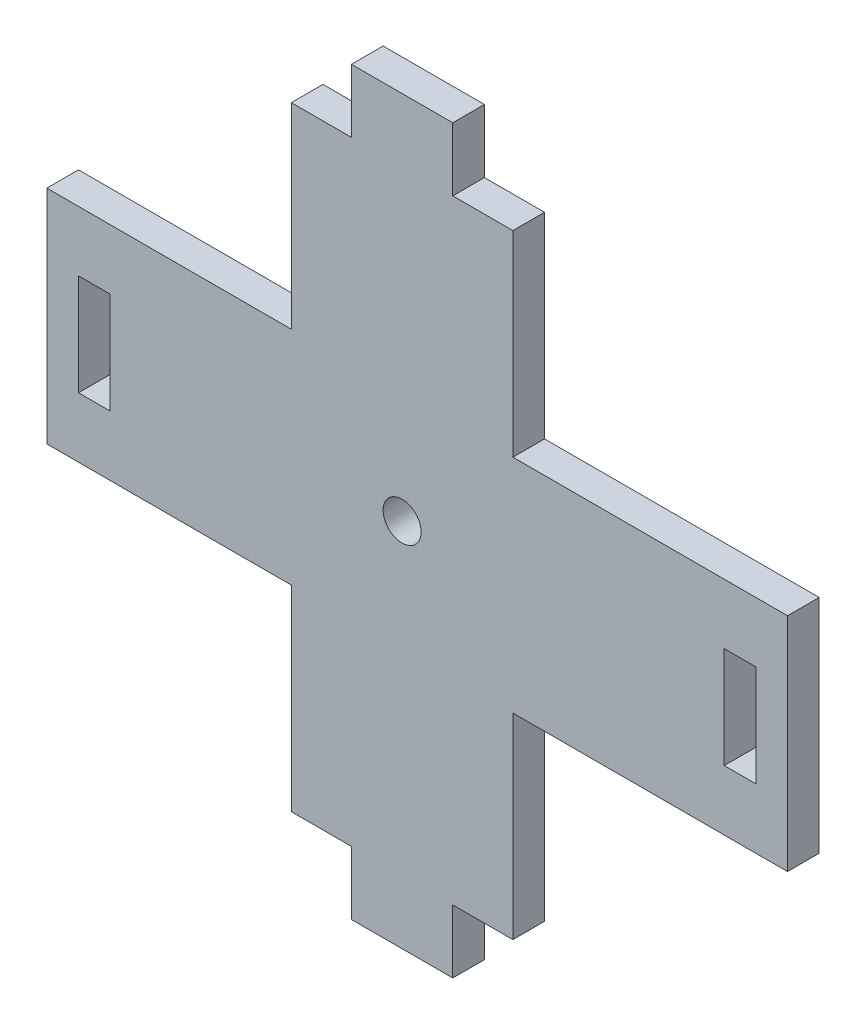
ISO-10303-21;
HEADER;
FILE_DESCRIPTION(('STEP AP214'),'2;1');
FILE_NAME('part.step','',(''),(''),'','','');
FILE_SCHEMA(('AUTOMOTIVE_DESIGN { 1 0 10303 214 1 1 1 1 }'));
ENDSEC;
DATA;
#1=APPLICATION_CONTEXT('core data for automotive mechanical design processes');
#2=APPLICATION_PROTOCOL_DEFINITION('international standard','automotive_design',2000,#1);
#3=PRODUCT_CONTEXT('',#1,'mechanical');
#4=PRODUCT('Part','Part','',(#3));
#5=PRODUCT_RELATED_PRODUCT_CATEGORY('part','',(#4));
#6=PRODUCT_DEFINITION_FORMATION('','',#4);
#7=PRODUCT_DEFINITION_CONTEXT('part definition',#1,'design');
#8=PRODUCT_DEFINITION('design','',#6,#7);
#9=PRODUCT_DEFINITION_SHAPE('','',#8);
#10=(LENGTH_UNIT() NAMED_UNIT(*) SI_UNIT(.MILLI.,.METRE.));
#11=(NAMED_UNIT(*) PLANE_ANGLE_UNIT() SI_UNIT($,.RADIAN.));
#12=(NAMED_UNIT(*) SI_UNIT($,.STERADIAN.) SOLID_ANGLE_UNIT());
#13=UNCERTAINTY_MEASURE_WITH_UNIT(LENGTH_MEASURE(1.E-05),#10,'distance_accuracy_value','');
#14=(GEOMETRIC_REPRESENTATION_CONTEXT(3) GLOBAL_UNCERTAINTY_ASSIGNED_CONTEXT((#13)) GLOBAL_UNIT_ASSIGNED_CONTEXT((#10,
#11,#12)) REPRESENTATION_CONTEXT('',''));
#15=CARTESIAN_POINT('',(0.,0.,0.));
#16=DIRECTION('',(0.,0.,1.));
#17=DIRECTION('',(1.,0.,0.));
#18=AXIS2_PLACEMENT_3D('',#15,#16,#17);
#19=CARTESIAN_POINT('',(0.,0.,5.));
#20=DIRECTION('',(1.,0.,0.));
#21=DIRECTION('',(0.,0.,-1.));
#22=AXIS2_PLACEMENT_3D('',#19,#20,#21);
#23=PLANE('',#22);
#24=DIRECTION('',(0.,-1.,0.));
#25=VECTOR('',#24,1.);
#26=CARTESIAN_POINT('',(0.,0.,0.));
#27=LINE('',#26,#25);
#28=CARTESIAN_POINT('',(0.,35.,0.));
#29=VERTEX_POINT('',#28);
#30=CARTESIAN_POINT('',(0.,0.,0.));
#31=VERTEX_POINT('',#30);
#32=EDGE_CURVE('E256',#29,#31,#27,.T.);
#33=ORIENTED_EDGE('',*,*,#32,.T.);
#34=DIRECTION('',(0.,0.,-1.));
#35=VECTOR('',#34,1.);
#36=CARTESIAN_POINT('',(0.,0.,5.));
#37=LINE('',#36,#35);
#38=CARTESIAN_POINT('',(0.,0.,5.));
#39=VERTEX_POINT('',#38);
#40=EDGE_CURVE('E11',#39,#31,#37,.T.);
#41=ORIENTED_EDGE('',*,*,#40,.F.);
#42=DIRECTION('',(0.,-1.,0.));
#43=VECTOR('',#42,1.);
#44=CARTESIAN_POINT('',(0.,0.,5.));
#45=LINE('',#44,#43);
#46=CARTESIAN_POINT('',(0.,35.,5.));
#47=VERTEX_POINT('',#46);
#48=EDGE_CURVE('E290',#47,#39,#45,.T.);
#49=ORIENTED_EDGE('',*,*,#48,.F.);
#50=DIRECTION('',(0.,0.,-1.));
#51=VECTOR('',#50,1.);
#52=CARTESIAN_POINT('',(0.,35.,5.));
#53=LINE('',#52,#51);
#54=EDGE_CURVE('E332',#47,#29,#53,.T.);
#55=ORIENTED_EDGE('',*,*,#54,.T.);
#56=EDGE_LOOP('',(#33,#41,#49,#55));
#57=FACE_BOUND('',#56,.T.);
#58=ADVANCED_FACE('F32',(#57),#23,.F.);
#59=CARTESIAN_POINT('',(0.,0.,5.));
#60=DIRECTION('',(0.,1.,0.));
#61=DIRECTION('',(0.,0.,1.));
#62=AXIS2_PLACEMENT_3D('',#59,#60,#61);
#63=PLANE('',#62);
#64=DIRECTION('',(1.,0.,0.));
#65=VECTOR('',#64,1.);
#66=CARTESIAN_POINT('',(0.,0.,0.));
#67=LINE('',#66,#65);
#68=CARTESIAN_POINT('',(38.6194976198017,0.,0.));
#69=VERTEX_POINT('',#68);
#70=EDGE_CURVE('E335',#31,#69,#67,.T.);
#71=ORIENTED_EDGE('',*,*,#70,.T.);
#72=DIRECTION('',(0.,0.,-1.));
#73=VECTOR('',#72,1.);
#74=CARTESIAN_POINT('',(38.6194976198017,0.,5.));
#75=LINE('',#74,#73);
#76=CARTESIAN_POINT('',(38.6194976198017,0.,5.));
#77=VERTEX_POINT('',#76);
#78=EDGE_CURVE('E39',#77,#69,#75,.T.);
#79=ORIENTED_EDGE('',*,*,#78,.F.);
#80=DIRECTION('',(1.,0.,0.));
#81=VECTOR('',#80,1.);
#82=CARTESIAN_POINT('',(0.,0.,5.));
#83=LINE('',#82,#81);
#84=EDGE_CURVE('E293',#39,#77,#83,.T.);
#85=ORIENTED_EDGE('',*,*,#84,.F.);
#86=ORIENTED_EDGE('',*,*,#40,.T.);
#87=EDGE_LOOP('',(#71,#79,#85,#86));
#88=FACE_BOUND('',#87,.T.);
#89=ADVANCED_FACE('F451',(#88),#63,.F.);
#90=CARTESIAN_POINT('',(38.6194976198017,0.,5.));
#91=DIRECTION('',(1.,0.,0.));
#92=DIRECTION('',(0.,1.,0.));
#93=AXIS2_PLACEMENT_3D('',#90,#91,#92);
#94=PLANE('',#93);
#95=DIRECTION('',(0.,-1.,0.));
#96=VECTOR('',#95,1.);
#97=CARTESIAN_POINT('',(38.6194976198017,0.,0.));
#98=LINE('',#97,#96);
#99=CARTESIAN_POINT('',(38.6194976198017,-31.,0.));
#100=VERTEX_POINT('',#99);
#101=EDGE_CURVE('E337',#69,#100,#98,.T.);
#102=ORIENTED_EDGE('',*,*,#101,.T.);
#103=DIRECTION('',(0.,0.,-1.));
#104=VECTOR('',#103,1.);
#105=CARTESIAN_POINT('',(38.6194976198017,-31.,5.));
#106=LINE('',#105,#104);
#107=CARTESIAN_POINT('',(38.6194976198017,-31.,5.));
#108=VERTEX_POINT('',#107);
#109=EDGE_CURVE('E422',#108,#100,#106,.T.);
#110=ORIENTED_EDGE('',*,*,#109,.F.);
#111=DIRECTION('',(0.,-1.,0.));
#112=VECTOR('',#111,1.);
#113=CARTESIAN_POINT('',(38.6194976198017,0.,5.));
#114=LINE('',#113,#112);
#115=EDGE_CURVE('E296',#77,#108,#114,.T.);
#116=ORIENTED_EDGE('',*,*,#115,.F.);
#117=ORIENTED_EDGE('',*,*,#78,.T.);
#118=EDGE_LOOP('',(#102,#110,#116,#117));
#119=FACE_BOUND('',#118,.T.);
#120=ADVANCED_FACE('F429',(#119),#94,.F.);
#121=CARTESIAN_POINT('',(38.6194976198017,-31.,5.));
#122=DIRECTION('',(0.,1.,0.));
#123=DIRECTION('',(-1.,0.,0.));
#124=AXIS2_PLACEMENT_3D('',#121,#122,#123);
#125=PLANE('',#124);
#126=DIRECTION('',(1.,0.,0.));
#127=VECTOR('',#126,1.);
#128=CARTESIAN_POINT('',(38.6194976198017,-31.,0.));
#129=LINE('',#128,#127);
#130=CARTESIAN_POINT('',(48.1194976198017,-31.,0.));
#131=VERTEX_POINT('',#130);
#132=EDGE_CURVE('E339',#100,#131,#129,.T.);
#133=ORIENTED_EDGE('',*,*,#132,.T.);
#134=DIRECTION('',(0.,0.,-1.));
#135=VECTOR('',#134,1.);
#136=CARTESIAN_POINT('',(48.1194976198017,-31.,5.));
#137=LINE('',#136,#135);
#138=CARTESIAN_POINT('',(48.1194976198017,-31.,5.));
#139=VERTEX_POINT('',#138);
#140=EDGE_CURVE('E419',#139,#131,#137,.T.);
#141=ORIENTED_EDGE('',*,*,#140,.F.);
#142=DIRECTION('',(1.,0.,0.));
#143=VECTOR('',#142,1.);
#144=CARTESIAN_POINT('',(38.6194976198017,-31.,5.));
#145=LINE('',#144,#143);
#146=EDGE_CURVE('E298',#108,#139,#145,.T.);
#147=ORIENTED_EDGE('',*,*,#146,.F.);
#148=ORIENTED_EDGE('',*,*,#109,.T.);
#149=EDGE_LOOP('',(#133,#141,#147,#148));
#150=FACE_BOUND('',#149,.T.);
#151=ADVANCED_FACE('F439',(#150),#125,.F.);
#152=CARTESIAN_POINT('',(48.1194976198017,-31.,5.));
#153=DIRECTION('',(1.,0.,0.));
#154=DIRECTION('',(0.,0.,-1.));
#155=AXIS2_PLACEMENT_3D('',#152,#153,#154);
#156=PLANE('',#155);
#157=DIRECTION('',(0.,-1.,0.));
#158=VECTOR('',#157,1.);
#159=CARTESIAN_POINT('',(48.1194976198017,-31.,0.));
#160=LINE('',#159,#158);
#161=CARTESIAN_POINT('',(48.1194976198017,-41.,0.));
#162=VERTEX_POINT('',#161);
#163=EDGE_CURVE('E341',#131,#162,#160,.T.);
#164=ORIENTED_EDGE('',*,*,#163,.T.);
#165=DIRECTION('',(0.,0.,-1.));
#166=VECTOR('',#165,1.);
#167=CARTESIAN_POINT('',(48.1194976198017,-41.,5.));
#168=LINE('',#167,#166);
#169=CARTESIAN_POINT('',(48.1194976198017,-41.,5.));
#170=VERTEX_POINT('',#169);
#171=EDGE_CURVE('E416',#170,#162,#168,.T.);
#172=ORIENTED_EDGE('',*,*,#171,.F.);
#173=DIRECTION('',(0.,-1.,0.));
#174=VECTOR('',#173,1.);
#175=CARTESIAN_POINT('',(48.1194976198017,-31.,5.));
#176=LINE('',#175,#174);
#177=EDGE_CURVE('E300',#139,#170,#176,.T.);
#178=ORIENTED_EDGE('',*,*,#177,.F.);
#179=ORIENTED_EDGE('',*,*,#140,.T.);
#180=EDGE_LOOP('',(#164,#172,#178,#179));
#181=FACE_BOUND('',#180,.T.);
#182=ADVANCED_FACE('F443',(#181),#156,.F.);
#183=CARTESIAN_POINT('',(48.1194976198017,-41.,5.));
#184=DIRECTION('',(0.,1.,0.));
#185=DIRECTION('',(0.,0.,1.));
#186=AXIS2_PLACEMENT_3D('',#183,#184,#185);
#187=PLANE('',#186);
#188=DIRECTION('',(1.,0.,0.));
#189=VECTOR('',#188,1.);
#190=CARTESIAN_POINT('',(48.1194976198017,-41.,0.));
#191=LINE('',#190,#189);
#192=CARTESIAN_POINT('',(64.1194976198017,-41.,0.));
#193=VERTEX_POINT('',#192);
#194=EDGE_CURVE('E343',#162,#193,#191,.T.);
#195=ORIENTED_EDGE('',*,*,#194,.T.);
#196=DIRECTION('',(0.,0.,-1.));
#197=VECTOR('',#196,1.);
#198=CARTESIAN_POINT('',(64.1194976198017,-41.,5.));
#199=LINE('',#198,#197);
#200=CARTESIAN_POINT('',(64.1194976198017,-41.,5.));
#201=VERTEX_POINT('',#200);
#202=EDGE_CURVE('E413',#201,#193,#199,.T.);
#203=ORIENTED_EDGE('',*,*,#202,.F.);
#204=DIRECTION('',(1.,0.,0.));
#205=VECTOR('',#204,1.);
#206=CARTESIAN_POINT('',(48.1194976198017,-41.,5.));
#207=LINE('',#206,#205);
#208=EDGE_CURVE('E302',#170,#201,#207,.T.);
#209=ORIENTED_EDGE('',*,*,#208,.F.);
#210=ORIENTED_EDGE('',*,*,#171,.T.);
#211=EDGE_LOOP('',(#195,#203,#209,#210));
#212=FACE_BOUND('',#211,.T.);
#213=ADVANCED_FACE('F524',(#212),#187,.F.);
#214=CARTESIAN_POINT('',(64.1194976198017,-31.,5.));
#215=DIRECTION('',(-1.,0.,0.));
#216=DIRECTION('',(0.,0.,1.));
#217=AXIS2_PLACEMENT_3D('',#214,#215,#216);
#218=PLANE('',#217);
#219=DIRECTION('',(0.,1.,0.));
#220=VECTOR('',#219,1.);
#221=CARTESIAN_POINT('',(64.1194976198017,-31.,0.));
#222=LINE('',#221,#220);
#223=CARTESIAN_POINT('',(64.1194976198017,-31.,0.));
#224=VERTEX_POINT('',#223);
#225=EDGE_CURVE('E345',#193,#224,#222,.T.);
#226=ORIENTED_EDGE('',*,*,#225,.T.);
#227=DIRECTION('',(0.,0.,-1.));
#228=VECTOR('',#227,1.);
#229=CARTESIAN_POINT('',(64.1194976198017,-31.,5.));
#230=LINE('',#229,#228);
#231=CARTESIAN_POINT('',(64.1194976198017,-31.,5.));
#232=VERTEX_POINT('',#231);
#233=EDGE_CURVE('E410',#232,#224,#230,.T.);
#234=ORIENTED_EDGE('',*,*,#233,.F.);
#235=DIRECTION('',(0.,1.,0.));
#236=VECTOR('',#235,1.);
#237=CARTESIAN_POINT('',(64.1194976198017,-31.,5.));
#238=LINE('',#237,#236);
#239=EDGE_CURVE('E304',#201,#232,#238,.T.);
#240=ORIENTED_EDGE('',*,*,#239,.F.);
#241=ORIENTED_EDGE('',*,*,#202,.T.);
#242=EDGE_LOOP('',(#226,#234,#240,#241));
#243=FACE_BOUND('',#242,.T.);
#244=ADVANCED_FACE('F522',(#243),#218,.F.);
#245=CARTESIAN_POINT('',(64.1194976198017,-31.,5.));
#246=DIRECTION('',(0.,1.,0.));
#247=DIRECTION('',(0.,0.,1.));
#248=AXIS2_PLACEMENT_3D('',#245,#246,#247);
#249=PLANE('',#248);
#250=DIRECTION('',(1.,0.,0.));
#251=VECTOR('',#250,1.);
#252=CARTESIAN_POINT('',(64.1194976198017,-31.,0.));
#253=LINE('',#252,#251);
#254=CARTESIAN_POINT('',(73.6194976198017,-31.,0.));
#255=VERTEX_POINT('',#254);
#256=EDGE_CURVE('E347',#224,#255,#253,.T.);
#257=ORIENTED_EDGE('',*,*,#256,.T.);
#258=DIRECTION('',(0.,0.,-1.));
#259=VECTOR('',#258,1.);
#260=CARTESIAN_POINT('',(73.6194976198017,-31.,5.));
#261=LINE('',#260,#259);
#262=CARTESIAN_POINT('',(73.6194976198017,-31.,5.));
#263=VERTEX_POINT('',#262);
#264=EDGE_CURVE('E407',#263,#255,#261,.T.);
#265=ORIENTED_EDGE('',*,*,#264,.F.);
#266=DIRECTION('',(1.,0.,0.));
#267=VECTOR('',#266,1.);
#268=CARTESIAN_POINT('',(64.1194976198017,-31.,5.));
#269=LINE('',#268,#267);
#270=EDGE_CURVE('E306',#232,#263,#269,.T.);
#271=ORIENTED_EDGE('',*,*,#270,.F.);
#272=ORIENTED_EDGE('',*,*,#233,.T.);
#273=EDGE_LOOP('',(#257,#265,#271,#272));
#274=FACE_BOUND('',#273,.T.);
#275=ADVANCED_FACE('F517',(#274),#249,.F.);
#276=CARTESIAN_POINT('',(73.6194976198017,0.,5.));
#277=DIRECTION('',(-1.,0.,0.));
#278=DIRECTION('',(0.,-1.,0.));
#279=AXIS2_PLACEMENT_3D('',#276,#277,#278);
#280=PLANE('',#279);
#281=DIRECTION('',(0.,1.,0.));
#282=VECTOR('',#281,1.);
#283=CARTESIAN_POINT('',(73.6194976198017,0.,0.));
#284=LINE('',#283,#282);
#285=CARTESIAN_POINT('',(73.6194976198017,0.,0.));
#286=VERTEX_POINT('',#285);
#287=EDGE_CURVE('E349',#255,#286,#284,.T.);
#288=ORIENTED_EDGE('',*,*,#287,.T.);
#289=DIRECTION('',(0.,0.,-1.));
#290=VECTOR('',#289,1.);
#291=CARTESIAN_POINT('',(73.6194976198017,0.,5.));
#292=LINE('',#291,#290);
#293=CARTESIAN_POINT('',(73.6194976198017,0.,5.));
#294=VERTEX_POINT('',#293);
#295=EDGE_CURVE('E404',#294,#286,#292,.T.);
#296=ORIENTED_EDGE('',*,*,#295,.F.);
#297=DIRECTION('',(0.,1.,0.));
#298=VECTOR('',#297,1.);
#299=CARTESIAN_POINT('',(73.6194976198017,0.,5.));
#300=LINE('',#299,#298);
#301=EDGE_CURVE('E308',#263,#294,#300,.T.);
#302=ORIENTED_EDGE('',*,*,#301,.F.);
#303=ORIENTED_EDGE('',*,*,#264,.T.);
#304=EDGE_LOOP('',(#288,#296,#302,#303));
#305=FACE_BOUND('',#304,.T.);
#306=ADVANCED_FACE('F512',(#305),#280,.F.);
#307=CARTESIAN_POINT('',(73.6194976198017,0.,5.));
#308=DIRECTION('',(0.,1.,0.));
#309=DIRECTION('',(-1.,0.,0.));
#310=AXIS2_PLACEMENT_3D('',#307,#308,#309);
#311=PLANE('',#310);
#312=DIRECTION('',(1.,0.,0.));
#313=VECTOR('',#312,1.);
#314=CARTESIAN_POINT('',(73.6194976198017,0.,0.));
#315=LINE('',#314,#313);
#316=CARTESIAN_POINT('',(117.,0.,0.));
#317=VERTEX_POINT('',#316);
#318=EDGE_CURVE('E351',#286,#317,#315,.T.);
#319=ORIENTED_EDGE('',*,*,#318,.T.);
#320=DIRECTION('',(0.,0.,-1.));
#321=VECTOR('',#320,1.);
#322=CARTESIAN_POINT('',(117.,0.,5.));
#323=LINE('',#322,#321);
#324=CARTESIAN_POINT('',(117.,0.,5.));
#325=VERTEX_POINT('',#324);
#326=EDGE_CURVE('E401',#325,#317,#323,.T.);
#327=ORIENTED_EDGE('',*,*,#326,.F.);
#328=DIRECTION('',(1.,0.,0.));
#329=VECTOR('',#328,1.);
#330=CARTESIAN_POINT('',(73.6194976198017,0.,5.));
#331=LINE('',#330,#329);
#332=EDGE_CURVE('E310',#294,#325,#331,.T.);
#333=ORIENTED_EDGE('',*,*,#332,.F.);
#334=ORIENTED_EDGE('',*,*,#295,.T.);
#335=EDGE_LOOP('',(#319,#327,#333,#334));
#336=FACE_BOUND('',#335,.T.);
#337=ADVANCED_FACE('F508',(#336),#311,.F.);
#338=CARTESIAN_POINT('',(117.,0.,5.));
#339=DIRECTION('',(-1.,0.,0.));
#340=DIRECTION('',(0.,0.,1.));
#341=AXIS2_PLACEMENT_3D('',#338,#339,#340);
#342=PLANE('',#341);
#343=DIRECTION('',(0.,1.,0.));
#344=VECTOR('',#343,1.);
#345=CARTESIAN_POINT('',(117.,0.,0.));
#346=LINE('',#345,#344);
#347=CARTESIAN_POINT('',(117.,35.,0.));
#348=VERTEX_POINT('',#347);
#349=EDGE_CURVE('E353',#317,#348,#346,.T.);
#350=ORIENTED_EDGE('',*,*,#349,.T.);
#351=DIRECTION('',(0.,0.,-1.));
#352=VECTOR('',#351,1.);
#353=CARTESIAN_POINT('',(117.,35.,5.));
#354=LINE('',#353,#352);
#355=CARTESIAN_POINT('',(117.,35.,5.));
#356=VERTEX_POINT('',#355);
#357=EDGE_CURVE('E398',#356,#348,#354,.T.);
#358=ORIENTED_EDGE('',*,*,#357,.F.);
#359=DIRECTION('',(0.,1.,0.));
#360=VECTOR('',#359,1.);
#361=CARTESIAN_POINT('',(117.,0.,5.));
#362=LINE('',#361,#360);
#363=EDGE_CURVE('E312',#325,#356,#362,.T.);
#364=ORIENTED_EDGE('',*,*,#363,.F.);
#365=ORIENTED_EDGE('',*,*,#326,.T.);
#366=EDGE_LOOP('',(#350,#358,#364,#365));
#367=FACE_BOUND('',#366,.T.);
#368=ADVANCED_FACE('F503',(#367),#342,.F.);
#369=CARTESIAN_POINT('',(73.6194976198017,35.,5.));
#370=DIRECTION('',(0.,-1.,0.));
#371=DIRECTION('',(1.,0.,0.));
#372=AXIS2_PLACEMENT_3D('',#369,#370,#371);
#373=PLANE('',#372);
#374=DIRECTION('',(-1.,0.,0.));
#375=VECTOR('',#374,1.);
#376=CARTESIAN_POINT('',(73.6194976198017,35.,0.));
#377=LINE('',#376,#375);
#378=CARTESIAN_POINT('',(73.6194976198017,35.,0.));
#379=VERTEX_POINT('',#378);
#380=EDGE_CURVE('E355',#348,#379,#377,.T.);
#381=ORIENTED_EDGE('',*,*,#380,.T.);
#382=DIRECTION('',(0.,0.,-1.));
#383=VECTOR('',#382,1.);
#384=CARTESIAN_POINT('',(73.6194976198017,35.,5.));
#385=LINE('',#384,#383);
#386=CARTESIAN_POINT('',(73.6194976198017,35.,5.));
#387=VERTEX_POINT('',#386);
#388=EDGE_CURVE('E395',#387,#379,#385,.T.);
#389=ORIENTED_EDGE('',*,*,#388,.F.);
#390=DIRECTION('',(-1.,0.,0.));
#391=VECTOR('',#390,1.);
#392=CARTESIAN_POINT('',(73.6194976198017,35.,5.));
#393=LINE('',#392,#391);
#394=EDGE_CURVE('E314',#356,#387,#393,.T.);
#395=ORIENTED_EDGE('',*,*,#394,.F.);
#396=ORIENTED_EDGE('',*,*,#357,.T.);
#397=EDGE_LOOP('',(#381,#389,#395,#396));
#398=FACE_BOUND('',#397,.T.);
#399=ADVANCED_FACE('F497',(#398),#373,.F.);
#400=CARTESIAN_POINT('',(73.6194976198017,66.,5.));
#401=DIRECTION('',(-1.,0.,0.));
#402=DIRECTION('',(0.,0.,1.));
#403=AXIS2_PLACEMENT_3D('',#400,#401,#402);
#404=PLANE('',#403);
#405=DIRECTION('',(0.,1.,0.));
#406=VECTOR('',#405,1.);
#407=CARTESIAN_POINT('',(73.6194976198017,66.,0.));
#408=LINE('',#407,#406);
#409=CARTESIAN_POINT('',(73.6194976198017,66.,0.));
#410=VERTEX_POINT('',#409);
#411=EDGE_CURVE('E357',#379,#410,#408,.T.);
#412=ORIENTED_EDGE('',*,*,#411,.T.);
#413=DIRECTION('',(0.,0.,-1.));
#414=VECTOR('',#413,1.);
#415=CARTESIAN_POINT('',(73.6194976198017,66.,5.));
#416=LINE('',#415,#414);
#417=CARTESIAN_POINT('',(73.6194976198017,66.,5.));
#418=VERTEX_POINT('',#417);
#419=EDGE_CURVE('E392',#418,#410,#416,.T.);
#420=ORIENTED_EDGE('',*,*,#419,.F.);
#421=DIRECTION('',(0.,1.,0.));
#422=VECTOR('',#421,1.);
#423=CARTESIAN_POINT('',(73.6194976198017,66.,5.));
#424=LINE('',#423,#422);
#425=EDGE_CURVE('E316',#387,#418,#424,.T.);
#426=ORIENTED_EDGE('',*,*,#425,.F.);
#427=ORIENTED_EDGE('',*,*,#388,.T.);
#428=EDGE_LOOP('',(#412,#420,#426,#427));
#429=FACE_BOUND('',#428,.T.);
#430=ADVANCED_FACE('F493',(#429),#404,.F.);
#431=CARTESIAN_POINT('',(64.1194976198017,66.,5.));
#432=DIRECTION('',(0.,-1.,0.));
#433=DIRECTION('',(0.,0.,-1.));
#434=AXIS2_PLACEMENT_3D('',#431,#432,#433);
#435=PLANE('',#434);
#436=DIRECTION('',(-1.,0.,0.));
#437=VECTOR('',#436,1.);
#438=CARTESIAN_POINT('',(64.1194976198017,66.,0.));
#439=LINE('',#438,#437);
#440=CARTESIAN_POINT('',(64.1194976198017,66.,0.));
#441=VERTEX_POINT('',#440);
#442=EDGE_CURVE('E359',#410,#441,#439,.T.);
#443=ORIENTED_EDGE('',*,*,#442,.T.);
#444=DIRECTION('',(0.,0.,-1.));
#445=VECTOR('',#444,1.);
#446=CARTESIAN_POINT('',(64.1194976198017,66.,5.));
#447=LINE('',#446,#445);
#448=CARTESIAN_POINT('',(64.1194976198017,66.,5.));
#449=VERTEX_POINT('',#448);
#450=EDGE_CURVE('E389',#449,#441,#447,.T.);
#451=ORIENTED_EDGE('',*,*,#450,.F.);
#452=DIRECTION('',(-1.,0.,0.));
#453=VECTOR('',#452,1.);
#454=CARTESIAN_POINT('',(64.1194976198017,66.,5.));
#455=LINE('',#454,#453);
#456=EDGE_CURVE('E318',#418,#449,#455,.T.);
#457=ORIENTED_EDGE('',*,*,#456,.F.);
#458=ORIENTED_EDGE('',*,*,#419,.T.);
#459=EDGE_LOOP('',(#443,#451,#457,#458));
#460=FACE_BOUND('',#459,.T.);
#461=ADVANCED_FACE('F488',(#460),#435,.F.);
#462=CARTESIAN_POINT('',(64.1194976198017,76.,5.));
#463=DIRECTION('',(-1.,0.,0.));
#464=DIRECTION('',(0.,0.,1.));
#465=AXIS2_PLACEMENT_3D('',#462,#463,#464);
#466=PLANE('',#465);
#467=DIRECTION('',(0.,1.,0.));
#468=VECTOR('',#467,1.);
#469=CARTESIAN_POINT('',(64.1194976198017,76.,0.));
#470=LINE('',#469,#468);
#471=CARTESIAN_POINT('',(64.1194976198017,76.,0.));
#472=VERTEX_POINT('',#471);
#473=EDGE_CURVE('E361',#441,#472,#470,.T.);
#474=ORIENTED_EDGE('',*,*,#473,.T.);
#475=DIRECTION('',(0.,0.,-1.));
#476=VECTOR('',#475,1.);
#477=CARTESIAN_POINT('',(64.1194976198017,76.,5.));
#478=LINE('',#477,#476);
#479=CARTESIAN_POINT('',(64.1194976198017,76.,5.));
#480=VERTEX_POINT('',#479);
#481=EDGE_CURVE('E386',#480,#472,#478,.T.);
#482=ORIENTED_EDGE('',*,*,#481,.F.);
#483=DIRECTION('',(0.,1.,0.));
#484=VECTOR('',#483,1.);
#485=CARTESIAN_POINT('',(64.1194976198017,76.,5.));
#486=LINE('',#485,#484);
#487=EDGE_CURVE('E320',#449,#480,#486,.T.);
#488=ORIENTED_EDGE('',*,*,#487,.F.);
#489=ORIENTED_EDGE('',*,*,#450,.T.);
#490=EDGE_LOOP('',(#474,#482,#488,#489));
#491=FACE_BOUND('',#490,.T.);
#492=ADVANCED_FACE('F482',(#491),#466,.F.);
#493=CARTESIAN_POINT('',(48.1194976198017,76.,5.));
#494=DIRECTION('',(0.,-1.,0.));
#495=DIRECTION('',(0.,0.,-1.));
#496=AXIS2_PLACEMENT_3D('',#493,#494,#495);
#497=PLANE('',#496);
#498=DIRECTION('',(-1.,0.,0.));
#499=VECTOR('',#498,1.);
#500=CARTESIAN_POINT('',(48.1194976198017,76.,0.));
#501=LINE('',#500,#499);
#502=CARTESIAN_POINT('',(48.1194976198017,76.,0.));
#503=VERTEX_POINT('',#502);
#504=EDGE_CURVE('E363',#472,#503,#501,.T.);
#505=ORIENTED_EDGE('',*,*,#504,.T.);
#506=DIRECTION('',(0.,0.,-1.));
#507=VECTOR('',#506,1.);
#508=CARTESIAN_POINT('',(48.1194976198017,76.,5.));
#509=LINE('',#508,#507);
#510=CARTESIAN_POINT('',(48.1194976198017,76.,5.));
#511=VERTEX_POINT('',#510);
#512=EDGE_CURVE('E383',#511,#503,#509,.T.);
#513=ORIENTED_EDGE('',*,*,#512,.F.);
#514=DIRECTION('',(-1.,0.,0.));
#515=VECTOR('',#514,1.);
#516=CARTESIAN_POINT('',(48.1194976198017,76.,5.));
#517=LINE('',#516,#515);
#518=EDGE_CURVE('E322',#480,#511,#517,.T.);
#519=ORIENTED_EDGE('',*,*,#518,.F.);
#520=ORIENTED_EDGE('',*,*,#481,.T.);
#521=EDGE_LOOP('',(#505,#513,#519,#520));
#522=FACE_BOUND('',#521,.T.);
#523=ADVANCED_FACE('F478',(#522),#497,.F.);
#524=CARTESIAN_POINT('',(48.1194976198017,76.,5.));
#525=DIRECTION('',(1.,0.,0.));
#526=DIRECTION('',(0.,1.,0.));
#527=AXIS2_PLACEMENT_3D('',#524,#525,#526);
#528=PLANE('',#527);
#529=DIRECTION('',(0.,-1.,0.));
#530=VECTOR('',#529,1.);
#531=CARTESIAN_POINT('',(48.1194976198017,76.,0.));
#532=LINE('',#531,#530);
#533=CARTESIAN_POINT('',(48.1194976198017,66.,0.));
#534=VERTEX_POINT('',#533);
#535=EDGE_CURVE('E365',#503,#534,#532,.T.);
#536=ORIENTED_EDGE('',*,*,#535,.T.);
#537=DIRECTION('',(0.,0.,-1.));
#538=VECTOR('',#537,1.);
#539=CARTESIAN_POINT('',(48.1194976198017,66.,5.));
#540=LINE('',#539,#538);
#541=CARTESIAN_POINT('',(48.1194976198017,66.,5.));
#542=VERTEX_POINT('',#541);
#543=EDGE_CURVE('E380',#542,#534,#540,.T.);
#544=ORIENTED_EDGE('',*,*,#543,.F.);
#545=DIRECTION('',(0.,-1.,0.));
#546=VECTOR('',#545,1.);
#547=CARTESIAN_POINT('',(48.1194976198017,76.,5.));
#548=LINE('',#547,#546);
#549=EDGE_CURVE('E324',#511,#542,#548,.T.);
#550=ORIENTED_EDGE('',*,*,#549,.F.);
#551=ORIENTED_EDGE('',*,*,#512,.T.);
#552=EDGE_LOOP('',(#536,#544,#550,#551));
#553=FACE_BOUND('',#552,.T.);
#554=ADVANCED_FACE('F473',(#553),#528,.F.);
#555=CARTESIAN_POINT('',(38.6194976198017,66.,5.));
#556=DIRECTION('',(0.,-1.,0.));
#557=DIRECTION('',(0.,0.,-1.));
#558=AXIS2_PLACEMENT_3D('',#555,#556,#557);
#559=PLANE('',#558);
#560=DIRECTION('',(-1.,0.,0.));
#561=VECTOR('',#560,1.);
#562=CARTESIAN_POINT('',(38.6194976198017,66.,0.));
#563=LINE('',#562,#561);
#564=CARTESIAN_POINT('',(38.6194976198017,66.,0.));
#565=VERTEX_POINT('',#564);
#566=EDGE_CURVE('E367',#534,#565,#563,.T.);
#567=ORIENTED_EDGE('',*,*,#566,.T.);
#568=DIRECTION('',(0.,0.,-1.));
#569=VECTOR('',#568,1.);
#570=CARTESIAN_POINT('',(38.6194976198017,66.,5.));
#571=LINE('',#570,#569);
#572=CARTESIAN_POINT('',(38.6194976198017,66.,5.));
#573=VERTEX_POINT('',#572);
#574=EDGE_CURVE('E377',#573,#565,#571,.T.);
#575=ORIENTED_EDGE('',*,*,#574,.F.);
#576=DIRECTION('',(-1.,0.,0.));
#577=VECTOR('',#576,1.);
#578=CARTESIAN_POINT('',(38.6194976198017,66.,5.));
#579=LINE('',#578,#577);
#580=EDGE_CURVE('E326',#542,#573,#579,.T.);
#581=ORIENTED_EDGE('',*,*,#580,.F.);
#582=ORIENTED_EDGE('',*,*,#543,.T.);
#583=EDGE_LOOP('',(#567,#575,#581,#582));
#584=FACE_BOUND('',#583,.T.);
#585=ADVANCED_FACE('F467',(#584),#559,.F.);
#586=CARTESIAN_POINT('',(38.6194976198017,66.,5.));
#587=DIRECTION('',(1.,0.,0.));
#588=DIRECTION('',(0.,1.,0.));
#589=AXIS2_PLACEMENT_3D('',#586,#587,#588);
#590=PLANE('',#589);
#591=DIRECTION('',(0.,-1.,0.));
#592=VECTOR('',#591,1.);
#593=CARTESIAN_POINT('',(38.6194976198017,66.,0.));
#594=LINE('',#593,#592);
#595=CARTESIAN_POINT('',(38.6194976198017,35.,0.));
#596=VERTEX_POINT('',#595);
#597=EDGE_CURVE('E369',#565,#596,#594,.T.);
#598=ORIENTED_EDGE('',*,*,#597,.T.);
#599=DIRECTION('',(0.,0.,-1.));
#600=VECTOR('',#599,1.);
#601=CARTESIAN_POINT('',(38.6194976198017,35.,5.));
#602=LINE('',#601,#600);
#603=CARTESIAN_POINT('',(38.6194976198017,35.,5.));
#604=VERTEX_POINT('',#603);
#605=EDGE_CURVE('E374',#604,#596,#602,.T.);
#606=ORIENTED_EDGE('',*,*,#605,.F.);
#607=DIRECTION('',(0.,-1.,0.));
#608=VECTOR('',#607,1.);
#609=CARTESIAN_POINT('',(38.6194976198017,66.,5.));
#610=LINE('',#609,#608);
#611=EDGE_CURVE('E328',#573,#604,#610,.T.);
#612=ORIENTED_EDGE('',*,*,#611,.F.);
#613=ORIENTED_EDGE('',*,*,#574,.T.);
#614=EDGE_LOOP('',(#598,#606,#612,#613));
#615=FACE_BOUND('',#614,.T.);
#616=ADVANCED_FACE('F463',(#615),#590,.F.);
#617=CARTESIAN_POINT('',(0.,35.,5.));
#618=DIRECTION('',(0.,-1.,0.));
#619=DIRECTION('',(0.,0.,-1.));
#620=AXIS2_PLACEMENT_3D('',#617,#618,#619);
#621=PLANE('',#620);
#622=DIRECTION('',(-1.,0.,0.));
#623=VECTOR('',#622,1.);
#624=CARTESIAN_POINT('',(0.,35.,0.));
#625=LINE('',#624,#623);
#626=EDGE_CURVE('E294',#596,#29,#625,.T.);
#627=ORIENTED_EDGE('',*,*,#626,.T.);
#628=ORIENTED_EDGE('',*,*,#54,.F.);
#629=DIRECTION('',(-1.,0.,0.));
#630=VECTOR('',#629,1.);
#631=CARTESIAN_POINT('',(0.,35.,5.));
#632=LINE('',#631,#630);
#633=EDGE_CURVE('E330',#604,#47,#632,.T.);
#634=ORIENTED_EDGE('',*,*,#633,.F.);
#635=ORIENTED_EDGE('',*,*,#605,.T.);
#636=EDGE_LOOP('',(#627,#628,#634,#635));
#637=FACE_BOUND('',#636,.T.);
#638=ADVANCED_FACE('F458',(#637),#621,.F.);
#639=CARTESIAN_POINT('',(0.,0.,5.));
#640=DIRECTION('',(0.,0.,-1.));
#641=DIRECTION('',(-1.,0.,0.));
#642=AXIS2_PLACEMENT_3D('',#639,#640,#641);
#643=PLANE('',#642);
#644=CARTESIAN_POINT('',(56.1194976198017,17.5,5.));
#645=DIRECTION('',(0.,0.,1.));
#646=DIRECTION('',(1.,0.,0.));
#647=AXIS2_PLACEMENT_3D('',#644,#645,#646);
#648=CIRCLE('',#647,3.);
#649=CARTESIAN_POINT('',(59.1194976198017,17.5,5.));
#650=VERTEX_POINT('',#649);
#651=EDGE_CURVE('E243',#650,#650,#648,.T.);
#652=ORIENTED_EDGE('',*,*,#651,.F.);
#653=EDGE_LOOP('',(#652));
#654=FACE_BOUND('',#653,.T.);
#655=DIRECTION('',(1.,0.,0.));
#656=VECTOR('',#655,1.);
#657=CARTESIAN_POINT('',(5.,9.5,5.));
#658=LINE('',#657,#656);
#659=CARTESIAN_POINT('',(5.,9.5,5.));
#660=VERTEX_POINT('',#659);
#661=CARTESIAN_POINT('',(10.,9.5,5.));
#662=VERTEX_POINT('',#661);
#663=EDGE_CURVE('E249',#660,#662,#658,.T.);
#664=ORIENTED_EDGE('',*,*,#663,.F.);
#665=DIRECTION('',(0.,-1.,0.));
#666=VECTOR('',#665,1.);
#667=CARTESIAN_POINT('',(5.,25.5,5.));
#668=LINE('',#667,#666);
#669=CARTESIAN_POINT('',(5.,25.5,5.));
#670=VERTEX_POINT('',#669);
#671=EDGE_CURVE('E46',#670,#660,#668,.T.);
#672=ORIENTED_EDGE('',*,*,#671,.F.);
#673=DIRECTION('',(-1.,0.,0.));
#674=VECTOR('',#673,1.);
#675=CARTESIAN_POINT('',(5.,25.5,5.));
#676=LINE('',#675,#674);
#677=CARTESIAN_POINT('',(10.,25.5,5.));
#678=VERTEX_POINT('',#677);
#679=EDGE_CURVE('E237',#678,#670,#676,.T.);
#680=ORIENTED_EDGE('',*,*,#679,.F.);
#681=DIRECTION('',(0.,1.,0.));
#682=VECTOR('',#681,1.);
#683=CARTESIAN_POINT('',(10.,25.5,5.));
#684=LINE('',#683,#682);
#685=EDGE_CURVE('E240',#662,#678,#684,.T.);
#686=ORIENTED_EDGE('',*,*,#685,.F.);
#687=EDGE_LOOP('',(#664,#672,#680,#686));
#688=FACE_BOUND('',#687,.T.);
#689=DIRECTION('',(1.,0.,0.));
#690=VECTOR('',#689,1.);
#691=CARTESIAN_POINT('',(107.,9.5,5.));
#692=LINE('',#691,#690);
#693=CARTESIAN_POINT('',(107.,9.5,5.));
#694=VERTEX_POINT('',#693);
#695=CARTESIAN_POINT('',(112.,9.5,5.));
#696=VERTEX_POINT('',#695);
#697=EDGE_CURVE('E275',#694,#696,#692,.T.);
#698=ORIENTED_EDGE('',*,*,#697,.F.);
#699=DIRECTION('',(0.,-1.,0.));
#700=VECTOR('',#699,1.);
#701=CARTESIAN_POINT('',(107.,25.5,5.));
#702=LINE('',#701,#700);
#703=CARTESIAN_POINT('',(107.,25.5,5.));
#704=VERTEX_POINT('',#703);
#705=EDGE_CURVE('E54',#704,#694,#702,.T.);
#706=ORIENTED_EDGE('',*,*,#705,.F.);
#707=DIRECTION('',(-1.,0.,0.));
#708=VECTOR('',#707,1.);
#709=CARTESIAN_POINT('',(107.,25.5,5.));
#710=LINE('',#709,#708);
#711=CARTESIAN_POINT('',(112.,25.5,5.));
#712=VERTEX_POINT('',#711);
#713=EDGE_CURVE('E264',#712,#704,#710,.T.);
#714=ORIENTED_EDGE('',*,*,#713,.F.);
#715=DIRECTION('',(0.,1.,0.));
#716=VECTOR('',#715,1.);
#717=CARTESIAN_POINT('',(112.,25.5,5.));
#718=LINE('',#717,#716);
#719=EDGE_CURVE('E279',#696,#712,#718,.T.);
#720=ORIENTED_EDGE('',*,*,#719,.F.);
#721=EDGE_LOOP('',(#698,#706,#714,#720));
#722=FACE_BOUND('',#721,.T.);
#723=ORIENTED_EDGE('',*,*,#48,.T.);
#724=ORIENTED_EDGE('',*,*,#84,.T.);
#725=ORIENTED_EDGE('',*,*,#115,.T.);
#726=ORIENTED_EDGE('',*,*,#146,.T.);
#727=ORIENTED_EDGE('',*,*,#177,.T.);
#728=ORIENTED_EDGE('',*,*,#208,.T.);
#729=ORIENTED_EDGE('',*,*,#239,.T.);
#730=ORIENTED_EDGE('',*,*,#270,.T.);
#731=ORIENTED_EDGE('',*,*,#301,.T.);
#732=ORIENTED_EDGE('',*,*,#332,.T.);
#733=ORIENTED_EDGE('',*,*,#363,.T.);
#734=ORIENTED_EDGE('',*,*,#394,.T.);
#735=ORIENTED_EDGE('',*,*,#425,.T.);
#736=ORIENTED_EDGE('',*,*,#456,.T.);
#737=ORIENTED_EDGE('',*,*,#487,.T.);
#738=ORIENTED_EDGE('',*,*,#518,.T.);
#739=ORIENTED_EDGE('',*,*,#549,.T.);
#740=ORIENTED_EDGE('',*,*,#580,.T.);
#741=ORIENTED_EDGE('',*,*,#611,.T.);
#742=ORIENTED_EDGE('',*,*,#633,.T.);
#743=EDGE_LOOP('',(#723,#724,#725,#726,#727,#728,#729,#730,#731,#732,#733,#734,#735,#736,#737,
#738,#739,#740,#741,#742));
#744=FACE_BOUND('',#743,.T.);
#745=ADVANCED_FACE('F447',(#654,#688,#722,#744),#643,.F.);
#746=CARTESIAN_POINT('',(0.,0.,0.));
#747=DIRECTION('',(0.,0.,-1.));
#748=DIRECTION('',(-1.,0.,0.));
#749=AXIS2_PLACEMENT_3D('',#746,#747,#748);
#750=PLANE('',#749);
#751=CARTESIAN_POINT('',(56.1194976198017,17.5,0.));
#752=DIRECTION('',(0.,0.,1.));
#753=DIRECTION('',(1.,0.,0.));
#754=AXIS2_PLACEMENT_3D('',#751,#752,#753);
#755=CIRCLE('',#754,3.);
#756=CARTESIAN_POINT('',(59.1194976198017,17.5,0.));
#757=VERTEX_POINT('',#756);
#758=EDGE_CURVE('E276',#757,#757,#755,.T.);
#759=ORIENTED_EDGE('',*,*,#758,.T.);
#760=EDGE_LOOP('',(#759));
#761=FACE_BOUND('',#760,.T.);
#762=DIRECTION('',(0.,-1.,0.));
#763=VECTOR('',#762,1.);
#764=CARTESIAN_POINT('',(5.,25.5,0.));
#765=LINE('',#764,#763);
#766=CARTESIAN_POINT('',(5.,25.5,0.));
#767=VERTEX_POINT('',#766);
#768=CARTESIAN_POINT('',(5.,9.5,0.));
#769=VERTEX_POINT('',#768);
#770=EDGE_CURVE('E218',#767,#769,#765,.T.);
#771=ORIENTED_EDGE('',*,*,#770,.T.);
#772=DIRECTION('',(1.,0.,0.));
#773=VECTOR('',#772,1.);
#774=CARTESIAN_POINT('',(5.,9.5,0.));
#775=LINE('',#774,#773);
#776=CARTESIAN_POINT('',(10.,9.5,0.));
#777=VERTEX_POINT('',#776);
#778=EDGE_CURVE('E228',#769,#777,#775,.T.);
#779=ORIENTED_EDGE('',*,*,#778,.T.);
#780=DIRECTION('',(0.,1.,0.));
#781=VECTOR('',#780,1.);
#782=CARTESIAN_POINT('',(10.,25.5,0.));
#783=LINE('',#782,#781);
#784=CARTESIAN_POINT('',(10.,25.5,0.));
#785=VERTEX_POINT('',#784);
#786=EDGE_CURVE('E232',#777,#785,#783,.T.);
#787=ORIENTED_EDGE('',*,*,#786,.T.);
#788=DIRECTION('',(-1.,0.,0.));
#789=VECTOR('',#788,1.);
#790=CARTESIAN_POINT('',(5.,25.5,0.));
#791=LINE('',#790,#789);
#792=EDGE_CURVE('E224',#785,#767,#791,.T.);
#793=ORIENTED_EDGE('',*,*,#792,.T.);
#794=EDGE_LOOP('',(#771,#779,#787,#793));
#795=FACE_BOUND('',#794,.T.);
#796=DIRECTION('',(0.,-1.,0.));
#797=VECTOR('',#796,1.);
#798=CARTESIAN_POINT('',(107.,25.5,0.));
#799=LINE('',#798,#797);
#800=CARTESIAN_POINT('',(107.,25.5,0.));
#801=VERTEX_POINT('',#800);
#802=CARTESIAN_POINT('',(107.,9.5,0.));
#803=VERTEX_POINT('',#802);
#804=EDGE_CURVE('E260',#801,#803,#799,.T.);
#805=ORIENTED_EDGE('',*,*,#804,.T.);
#806=DIRECTION('',(1.,0.,0.));
#807=VECTOR('',#806,1.);
#808=CARTESIAN_POINT('',(107.,9.5,0.));
#809=LINE('',#808,#807);
#810=CARTESIAN_POINT('',(112.,9.5,0.));
#811=VERTEX_POINT('',#810);
#812=EDGE_CURVE('E263',#803,#811,#809,.T.);
#813=ORIENTED_EDGE('',*,*,#812,.T.);
#814=DIRECTION('',(0.,1.,0.));
#815=VECTOR('',#814,1.);
#816=CARTESIAN_POINT('',(112.,25.5,0.));
#817=LINE('',#816,#815);
#818=CARTESIAN_POINT('',(112.,25.5,0.));
#819=VERTEX_POINT('',#818);
#820=EDGE_CURVE('E267',#811,#819,#817,.T.);
#821=ORIENTED_EDGE('',*,*,#820,.T.);
#822=DIRECTION('',(-1.,0.,0.));
#823=VECTOR('',#822,1.);
#824=CARTESIAN_POINT('',(107.,25.5,0.));
#825=LINE('',#824,#823);
#826=EDGE_CURVE('E270',#819,#801,#825,.T.);
#827=ORIENTED_EDGE('',*,*,#826,.T.);
#828=EDGE_LOOP('',(#805,#813,#821,#827));
#829=FACE_BOUND('',#828,.T.);
#830=ORIENTED_EDGE('',*,*,#32,.F.);
#831=ORIENTED_EDGE('',*,*,#626,.F.);
#832=ORIENTED_EDGE('',*,*,#597,.F.);
#833=ORIENTED_EDGE('',*,*,#566,.F.);
#834=ORIENTED_EDGE('',*,*,#535,.F.);
#835=ORIENTED_EDGE('',*,*,#504,.F.);
#836=ORIENTED_EDGE('',*,*,#473,.F.);
#837=ORIENTED_EDGE('',*,*,#442,.F.);
#838=ORIENTED_EDGE('',*,*,#411,.F.);
#839=ORIENTED_EDGE('',*,*,#380,.F.);
#840=ORIENTED_EDGE('',*,*,#349,.F.);
#841=ORIENTED_EDGE('',*,*,#318,.F.);
#842=ORIENTED_EDGE('',*,*,#287,.F.);
#843=ORIENTED_EDGE('',*,*,#256,.F.);
#844=ORIENTED_EDGE('',*,*,#225,.F.);
#845=ORIENTED_EDGE('',*,*,#194,.F.);
#846=ORIENTED_EDGE('',*,*,#163,.F.);
#847=ORIENTED_EDGE('',*,*,#132,.F.);
#848=ORIENTED_EDGE('',*,*,#101,.F.);
#849=ORIENTED_EDGE('',*,*,#70,.F.);
#850=EDGE_LOOP('',(#830,#831,#832,#833,#834,#835,#836,#837,#838,#839,#840,#841,#842,#843,#844,
#845,#846,#847,#848,#849));
#851=FACE_BOUND('',#850,.T.);
#852=ADVANCED_FACE('F234',(#761,#795,#829,#851),#750,.T.);
#853=CARTESIAN_POINT('',(107.,25.5,0.));
#854=DIRECTION('',(-1.,0.,0.));
#855=DIRECTION('',(0.,0.,1.));
#856=AXIS2_PLACEMENT_3D('',#853,#854,#855);
#857=PLANE('',#856);
#858=ORIENTED_EDGE('',*,*,#705,.T.);
#859=DIRECTION('',(0.,0.,1.));
#860=VECTOR('',#859,1.);
#861=CARTESIAN_POINT('',(107.,9.5,0.));
#862=LINE('',#861,#860);
#863=EDGE_CURVE('E273',#803,#694,#862,.T.);
#864=ORIENTED_EDGE('',*,*,#863,.F.);
#865=ORIENTED_EDGE('',*,*,#804,.F.);
#866=DIRECTION('',(0.,0.,1.));
#867=VECTOR('',#866,1.);
#868=CARTESIAN_POINT('',(107.,25.5,0.));
#869=LINE('',#868,#867);
#870=EDGE_CURVE('E250',#801,#704,#869,.T.);
#871=ORIENTED_EDGE('',*,*,#870,.T.);
#872=EDGE_LOOP('',(#858,#864,#865,#871));
#873=FACE_BOUND('',#872,.T.);
#874=ADVANCED_FACE('F672',(#873),#857,.F.);
#875=CARTESIAN_POINT('',(107.,25.5,0.));
#876=DIRECTION('',(0.,1.,0.));
#877=DIRECTION('',(0.,0.,1.));
#878=AXIS2_PLACEMENT_3D('',#875,#876,#877);
#879=PLANE('',#878);
#880=ORIENTED_EDGE('',*,*,#713,.T.);
#881=ORIENTED_EDGE('',*,*,#870,.F.);
#882=ORIENTED_EDGE('',*,*,#826,.F.);
#883=DIRECTION('',(0.,0.,1.));
#884=VECTOR('',#883,1.);
#885=CARTESIAN_POINT('',(112.,25.5,0.));
#886=LINE('',#885,#884);
#887=EDGE_CURVE('E285',#819,#712,#886,.T.);
#888=ORIENTED_EDGE('',*,*,#887,.T.);
#889=EDGE_LOOP('',(#880,#881,#882,#888));
#890=FACE_BOUND('',#889,.T.);
#891=ADVANCED_FACE('F677',(#890),#879,.F.);
#892=CARTESIAN_POINT('',(112.,25.5,0.));
#893=DIRECTION('',(1.,0.,0.));
#894=DIRECTION('',(0.,0.,-1.));
#895=AXIS2_PLACEMENT_3D('',#892,#893,#894);
#896=PLANE('',#895);
#897=ORIENTED_EDGE('',*,*,#719,.T.);
#898=ORIENTED_EDGE('',*,*,#887,.F.);
#899=ORIENTED_EDGE('',*,*,#820,.F.);
#900=DIRECTION('',(0.,0.,1.));
#901=VECTOR('',#900,1.);
#902=CARTESIAN_POINT('',(112.,9.5,0.));
#903=LINE('',#902,#901);
#904=EDGE_CURVE('E287',#811,#696,#903,.T.);
#905=ORIENTED_EDGE('',*,*,#904,.T.);
#906=EDGE_LOOP('',(#897,#898,#899,#905));
#907=FACE_BOUND('',#906,.T.);
#908=ADVANCED_FACE('F688',(#907),#896,.F.);
#909=CARTESIAN_POINT('',(107.,9.5,0.));
#910=DIRECTION('',(0.,-1.,0.));
#911=DIRECTION('',(0.,0.,-1.));
#912=AXIS2_PLACEMENT_3D('',#909,#910,#911);
#913=PLANE('',#912);
#914=ORIENTED_EDGE('',*,*,#697,.T.);
#915=ORIENTED_EDGE('',*,*,#904,.F.);
#916=ORIENTED_EDGE('',*,*,#812,.F.);
#917=ORIENTED_EDGE('',*,*,#863,.T.);
#918=EDGE_LOOP('',(#914,#915,#916,#917));
#919=FACE_BOUND('',#918,.T.);
#920=ADVANCED_FACE('F698',(#919),#913,.F.);
#921=CARTESIAN_POINT('',(5.,25.5,0.));
#922=DIRECTION('',(-1.,0.,0.));
#923=DIRECTION('',(0.,0.,1.));
#924=AXIS2_PLACEMENT_3D('',#921,#922,#923);
#925=PLANE('',#924);
#926=ORIENTED_EDGE('',*,*,#671,.T.);
#927=DIRECTION('',(0.,0.,1.));
#928=VECTOR('',#927,1.);
#929=CARTESIAN_POINT('',(5.,9.5,0.));
#930=LINE('',#929,#928);
#931=EDGE_CURVE('E214',#769,#660,#930,.T.);
#932=ORIENTED_EDGE('',*,*,#931,.F.);
#933=ORIENTED_EDGE('',*,*,#770,.F.);
#934=DIRECTION('',(0.,0.,1.));
#935=VECTOR('',#934,1.);
#936=CARTESIAN_POINT('',(5.,25.5,0.));
#937=LINE('',#936,#935);
#938=EDGE_CURVE('E254',#767,#670,#937,.T.);
#939=ORIENTED_EDGE('',*,*,#938,.T.);
#940=EDGE_LOOP('',(#926,#932,#933,#939));
#941=FACE_BOUND('',#940,.T.);
#942=ADVANCED_FACE('F216',(#941),#925,.F.);
#943=CARTESIAN_POINT('',(5.,25.5,0.));
#944=DIRECTION('',(0.,1.,0.));
#945=DIRECTION('',(0.,0.,1.));
#946=AXIS2_PLACEMENT_3D('',#943,#944,#945);
#947=PLANE('',#946);
#948=ORIENTED_EDGE('',*,*,#679,.T.);
#949=ORIENTED_EDGE('',*,*,#938,.F.);
#950=ORIENTED_EDGE('',*,*,#792,.F.);
#951=DIRECTION('',(0.,0.,1.));
#952=VECTOR('',#951,1.);
#953=CARTESIAN_POINT('',(10.,25.5,0.));
#954=LINE('',#953,#952);
#955=EDGE_CURVE('E257',#785,#678,#954,.T.);
#956=ORIENTED_EDGE('',*,*,#955,.T.);
#957=EDGE_LOOP('',(#948,#949,#950,#956));
#958=FACE_BOUND('',#957,.T.);
#959=ADVANCED_FACE('F717',(#958),#947,.F.);
#960=CARTESIAN_POINT('',(10.,25.5,0.));
#961=DIRECTION('',(1.,0.,0.));
#962=DIRECTION('',(0.,0.,-1.));
#963=AXIS2_PLACEMENT_3D('',#960,#961,#962);
#964=PLANE('',#963);
#965=ORIENTED_EDGE('',*,*,#685,.T.);
#966=ORIENTED_EDGE('',*,*,#955,.F.);
#967=ORIENTED_EDGE('',*,*,#786,.F.);
#968=DIRECTION('',(0.,0.,1.));
#969=VECTOR('',#968,1.);
#970=CARTESIAN_POINT('',(10.,9.5,0.));
#971=LINE('',#970,#969);
#972=EDGE_CURVE('E223',#777,#662,#971,.T.);
#973=ORIENTED_EDGE('',*,*,#972,.T.);
#974=EDGE_LOOP('',(#965,#966,#967,#973));
#975=FACE_BOUND('',#974,.T.);
#976=ADVANCED_FACE('F726',(#975),#964,.F.);
#977=CARTESIAN_POINT('',(5.,9.5,0.));
#978=DIRECTION('',(0.,-1.,0.));
#979=DIRECTION('',(0.,0.,-1.));
#980=AXIS2_PLACEMENT_3D('',#977,#978,#979);
#981=PLANE('',#980);
#982=ORIENTED_EDGE('',*,*,#663,.T.);
#983=ORIENTED_EDGE('',*,*,#972,.F.);
#984=ORIENTED_EDGE('',*,*,#778,.F.);
#985=ORIENTED_EDGE('',*,*,#931,.T.);
#986=EDGE_LOOP('',(#982,#983,#984,#985));
#987=FACE_BOUND('',#986,.T.);
#988=ADVANCED_FACE('F229',(#987),#981,.F.);
#989=CARTESIAN_POINT('',(56.1194976198017,17.5,0.));
#990=DIRECTION('',(0.,0.,1.));
#991=DIRECTION('',(1.,0.,0.));
#992=AXIS2_PLACEMENT_3D('',#989,#990,#991);
#993=CYLINDRICAL_SURFACE('',#992,3.);
#994=ORIENTED_EDGE('',*,*,#758,.F.);
#995=EDGE_LOOP('',(#994));
#996=FACE_BOUND('',#995,.T.);
#997=ORIENTED_EDGE('',*,*,#651,.T.);
#998=EDGE_LOOP('',(#997));
#999=FACE_BOUND('',#998,.T.);
#1000=ADVANCED_FACE('F745',(#996,#999),#993,.F.);
#1001=CLOSED_SHELL('',(#58,#89,#120,#151,#182,#213,#244,#275,#306,#337,#368,#399,#430,#461,#492,
#523,#554,#585,#616,#638,#745,#852,#874,#891,#908,#920,#942,#959,#976,#988,#1000));
#1002=MANIFOLD_SOLID_BREP('B2',#1001);
#1003=ADVANCED_BREP_SHAPE_REPRESENTATION('',(#18,#1002),#14);
#1004=SHAPE_DEFINITION_REPRESENTATION(#9,#1003);
ENDSEC;
END-ISO-10303-21;
